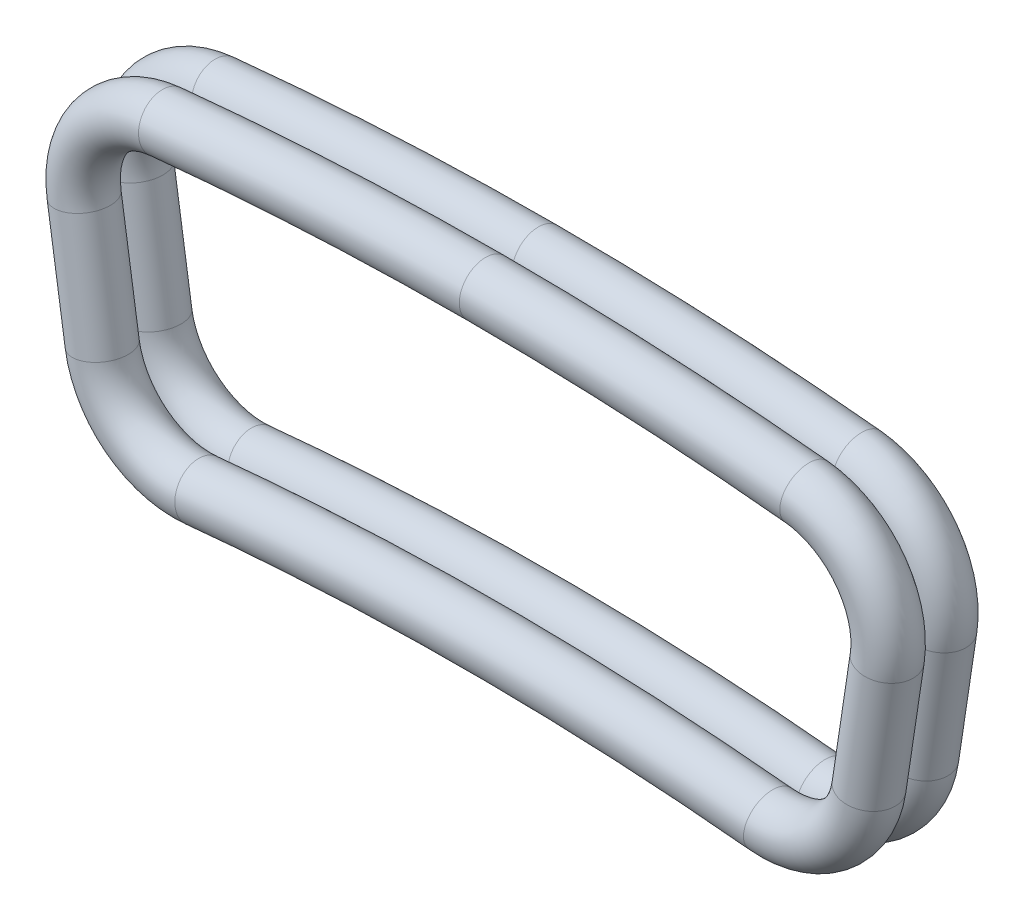
ISO-10303-21;
HEADER;
FILE_DESCRIPTION(('STEP AP214'),'2;1');
FILE_NAME('part.step','',(''),(''),'','','');
FILE_SCHEMA(('AUTOMOTIVE_DESIGN { 1 0 10303 214 1 1 1 1 }'));
ENDSEC;
DATA;
#1=APPLICATION_CONTEXT('core data for automotive mechanical design processes');
#2=APPLICATION_PROTOCOL_DEFINITION('international standard','automotive_design',2000,#1);
#3=PRODUCT_CONTEXT('',#1,'mechanical');
#4=PRODUCT('Part','Part','',(#3));
#5=PRODUCT_RELATED_PRODUCT_CATEGORY('part','',(#4));
#6=PRODUCT_DEFINITION_FORMATION('','',#4);
#7=PRODUCT_DEFINITION_CONTEXT('part definition',#1,'design');
#8=PRODUCT_DEFINITION('design','',#6,#7);
#9=PRODUCT_DEFINITION_SHAPE('','',#8);
#10=(LENGTH_UNIT() NAMED_UNIT(*) SI_UNIT(.MILLI.,.METRE.));
#11=(NAMED_UNIT(*) PLANE_ANGLE_UNIT() SI_UNIT($,.RADIAN.));
#12=(NAMED_UNIT(*) SI_UNIT($,.STERADIAN.) SOLID_ANGLE_UNIT());
#13=UNCERTAINTY_MEASURE_WITH_UNIT(LENGTH_MEASURE(1.E-05),#10,'distance_accuracy_value','');
#14=(GEOMETRIC_REPRESENTATION_CONTEXT(3) GLOBAL_UNCERTAINTY_ASSIGNED_CONTEXT((#13)) GLOBAL_UNIT_ASSIGNED_CONTEXT((#10,
#11,#12)) REPRESENTATION_CONTEXT('',''));
#15=CARTESIAN_POINT('',(0.,0.,0.));
#16=DIRECTION('',(0.,0.,1.));
#17=DIRECTION('',(1.,0.,0.));
#18=AXIS2_PLACEMENT_3D('',#15,#16,#17);
#19=CARTESIAN_POINT('',(0.,0.,-0.757999999999999));
#20=DIRECTION('',(0.,0.,-1.));
#21=DIRECTION('',(-1.,0.,0.));
#22=AXIS2_PLACEMENT_3D('',#19,#20,#21);
#23=TOROIDAL_SURFACE('',#22,98.186,0.814000000000007);
#24=CARTESIAN_POINT('',(-9.90528882125347,97.6850850916738,-0.757999999999999));
#25=DIRECTION('',(0.994898306191044,0.100882904092778,0.));
#26=DIRECTION('',(0.,0.,-1.));
#27=AXIS2_PLACEMENT_3D('',#24,#25,#26);
#28=CIRCLE('',#27,0.814000000000007);
#29=CARTESIAN_POINT('',(-9.98740750518499,98.4949323129133,-0.757999999999999));
#30=VERTEX_POINT('',#29);
#31=EDGE_CURVE('E11',#30,#30,#28,.T.);
#32=CARTESIAN_POINT('',(0.,98.186,-0.757999999999999));
#33=DIRECTION('',(1.,0.,0.));
#34=DIRECTION('',(0.,0.,-1.));
#35=AXIS2_PLACEMENT_3D('',#32,#33,#34);
#36=CIRCLE('',#35,0.814000000000007);
#37=CARTESIAN_POINT('',(0.,99.,-0.757999999999999));
#38=VERTEX_POINT('',#37);
#39=EDGE_CURVE('E78',#38,#38,#36,.T.);
#40=CARTESIAN_POINT('',(0.,0.,-0.757999999999999));
#41=DIRECTION('',(0.,0.,-1.));
#42=DIRECTION('',(-1.,0.,0.));
#43=AXIS2_PLACEMENT_3D('',#40,#41,#42);
#44=CIRCLE('',#43,99.);
#45=EDGE_CURVE('',#30,#38,#44,.T.);
#46=ORIENTED_EDGE('',*,*,#31,.T.);
#47=ORIENTED_EDGE('',*,*,#39,.F.);
#48=ORIENTED_EDGE('',*,*,#45,.T.);
#49=ORIENTED_EDGE('',*,*,#45,.F.);
#50=EDGE_LOOP('',(#46,#48,#47,#49));
#51=FACE_BOUND('',#50,.T.);
#52=ADVANCED_FACE('F47',(#51),#23,.T.);
#53=CARTESIAN_POINT('',(-9.62140432913657,94.8854412580522,-0.757999999999999));
#54=DIRECTION('',(0.,0.,-1.));
#55=DIRECTION('',(-1.,0.,0.));
#56=AXIS2_PLACEMENT_3D('',#53,#54,#55);
#57=TOROIDAL_SURFACE('',#56,2.81400000000001,0.814000000000007);
#58=CARTESIAN_POINT('',(-12.4039742741341,94.4660363210325,-0.757999999999999));
#59=DIRECTION('',(-0.149042266176174,0.988830826225129,0.));
#60=DIRECTION('',(0.,0.,-1.));
#61=AXIS2_PLACEMENT_3D('',#58,#59,#60);
#62=CIRCLE('',#61,0.814000000000007);
#63=CARTESIAN_POINT('',(-13.2088825666814,94.3447159163651,-0.757999999999999));
#64=VERTEX_POINT('',#63);
#65=EDGE_CURVE('E53',#64,#64,#62,.T.);
#66=CARTESIAN_POINT('',(-9.62140432913657,94.8854412580522,-0.757999999999999));
#67=DIRECTION('',(0.,0.,-1.));
#68=DIRECTION('',(-1.,0.,0.));
#69=AXIS2_PLACEMENT_3D('',#66,#67,#68);
#70=CIRCLE('',#69,3.62800000000002);
#71=EDGE_CURVE('',#64,#30,#70,.T.);
#72=ORIENTED_EDGE('',*,*,#65,.T.);
#73=ORIENTED_EDGE('',*,*,#31,.F.);
#74=ORIENTED_EDGE('',*,*,#71,.T.);
#75=ORIENTED_EDGE('',*,*,#71,.F.);
#76=EDGE_LOOP('',(#72,#74,#73,#75));
#77=FACE_BOUND('',#76,.T.);
#78=ADVANCED_FACE('F85',(#77),#57,.T.);
#79=CARTESIAN_POINT('',(-11.8452749318046,90.7593083809587,-0.757999999999999));
#80=DIRECTION('',(-0.149042266176174,0.988830826225129,0.));
#81=DIRECTION('',(-0.988830826225129,-0.149042266176174,0.));
#82=AXIS2_PLACEMENT_3D('',#79,#80,#81);
#83=CYLINDRICAL_SURFACE('',#82,0.814000000000007);
#84=ORIENTED_EDGE('',*,*,#65,.F.);
#85=EDGE_LOOP('',(#84));
#86=FACE_BOUND('',#85,.T.);
#87=CARTESIAN_POINT('',(-11.8452749318046,90.7593083809587,-0.757999999999999));
#88=DIRECTION('',(-0.149042266176173,0.988830826225129,0.));
#89=DIRECTION('',(0.,0.,-1.));
#90=AXIS2_PLACEMENT_3D('',#87,#88,#89);
#91=CIRCLE('',#90,0.814000000000007);
#92=CARTESIAN_POINT('',(-12.6501832243518,90.6379879762913,-0.757999999999999));
#93=VERTEX_POINT('',#92);
#94=EDGE_CURVE('E57',#93,#93,#91,.T.);
#95=ORIENTED_EDGE('',*,*,#94,.T.);
#96=EDGE_LOOP('',(#95));
#97=FACE_BOUND('',#96,.T.);
#98=ADVANCED_FACE('F89',(#86,#97),#83,.T.);
#99=CARTESIAN_POINT('',(-9.06270498680705,91.1787133179785,-0.757999999999999));
#100=DIRECTION('',(0.,0.,-1.));
#101=DIRECTION('',(-1.,0.,0.));
#102=AXIS2_PLACEMENT_3D('',#99,#100,#101);
#103=TOROIDAL_SURFACE('',#102,2.81399999999999,0.814000000000007);
#104=CARTESIAN_POINT('',(-8.78437901840359,88.378511422523,-0.757999999999999));
#105=DIRECTION('',(-0.995096622407763,-0.098907593604652,0.));
#106=DIRECTION('',(0.,0.,-1.));
#107=AXIS2_PLACEMENT_3D('',#104,#105,#106);
#108=CIRCLE('',#107,0.814000000000007);
#109=CARTESIAN_POINT('',(-8.70386823720942,87.5685027718831,-0.757999999999999));
#110=VERTEX_POINT('',#109);
#111=EDGE_CURVE('E61',#110,#110,#108,.T.);
#112=CARTESIAN_POINT('',(-9.06270498680705,91.1787133179785,-0.757999999999999));
#113=DIRECTION('',(0.,0.,-1.));
#114=DIRECTION('',(-1.,0.,0.));
#115=AXIS2_PLACEMENT_3D('',#112,#113,#114);
#116=CIRCLE('',#115,3.62799999999999);
#117=EDGE_CURVE('',#110,#93,#116,.T.);
#118=ORIENTED_EDGE('',*,*,#111,.T.);
#119=ORIENTED_EDGE('',*,*,#94,.F.);
#120=ORIENTED_EDGE('',*,*,#117,.T.);
#121=ORIENTED_EDGE('',*,*,#117,.F.);
#122=EDGE_LOOP('',(#118,#120,#119,#121));
#123=FACE_BOUND('',#122,.T.);
#124=ADVANCED_FACE('F94',(#123),#103,.T.);
#125=CARTESIAN_POINT('',(0.,0.,-0.757999999999999));
#126=DIRECTION('',(0.,0.,1.));
#127=DIRECTION('',(1.,0.,0.));
#128=AXIS2_PLACEMENT_3D('',#125,#126,#127);
#129=TOROIDAL_SURFACE('',#128,88.814,0.814000000000007);
#130=ORIENTED_EDGE('',*,*,#111,.F.);
#131=EDGE_LOOP('',(#130));
#132=FACE_BOUND('',#131,.T.);
#133=CARTESIAN_POINT('',(8.78437901840353,88.378511422523,-0.757999999999999));
#134=DIRECTION('',(-0.995096622407762,0.0989075936046599,0.));
#135=DIRECTION('',(0.,0.,-1.));
#136=AXIS2_PLACEMENT_3D('',#133,#134,#135);
#137=CIRCLE('',#136,0.814000000000007);
#138=CARTESIAN_POINT('',(8.70386823720933,87.5685027718831,-0.757999999999999));
#139=VERTEX_POINT('',#138);
#140=EDGE_CURVE('E66',#139,#139,#137,.T.);
#141=ORIENTED_EDGE('',*,*,#140,.T.);
#142=EDGE_LOOP('',(#141));
#143=FACE_BOUND('',#142,.T.);
#144=ADVANCED_FACE('F100',(#132,#143),#129,.T.);
#145=CARTESIAN_POINT('',(9.06270498680706,91.1787133179785,-0.757999999999999));
#146=DIRECTION('',(0.,0.,-1.));
#147=DIRECTION('',(-1.,0.,0.));
#148=AXIS2_PLACEMENT_3D('',#145,#146,#147);
#149=TOROIDAL_SURFACE('',#148,2.814,0.814000000000007);
#150=CARTESIAN_POINT('',(11.8452749318046,90.7593083809587,-0.757999999999999));
#151=DIRECTION('',(-0.149042266176172,-0.988830826225129,0.));
#152=DIRECTION('',(0.,0.,-1.));
#153=AXIS2_PLACEMENT_3D('',#150,#151,#152);
#154=CIRCLE('',#153,0.814000000000007);
#155=CARTESIAN_POINT('',(12.6501832243518,90.6379879762913,-0.757999999999999));
#156=VERTEX_POINT('',#155);
#157=EDGE_CURVE('E69',#156,#156,#154,.T.);
#158=CARTESIAN_POINT('',(9.06270498680706,91.1787133179785,-0.757999999999999));
#159=DIRECTION('',(0.,0.,-1.));
#160=DIRECTION('',(-1.,0.,0.));
#161=AXIS2_PLACEMENT_3D('',#158,#159,#160);
#162=CIRCLE('',#161,3.62800000000001);
#163=EDGE_CURVE('',#156,#139,#162,.T.);
#164=ORIENTED_EDGE('',*,*,#157,.T.);
#165=ORIENTED_EDGE('',*,*,#140,.F.);
#166=ORIENTED_EDGE('',*,*,#163,.T.);
#167=ORIENTED_EDGE('',*,*,#163,.F.);
#168=EDGE_LOOP('',(#164,#166,#165,#167));
#169=FACE_BOUND('',#168,.T.);
#170=ADVANCED_FACE('F104',(#169),#149,.T.);
#171=CARTESIAN_POINT('',(12.4039742741341,94.4660363210324,-0.757999999999999));
#172=DIRECTION('',(-0.149042266176172,-0.988830826225129,0.));
#173=DIRECTION('',(0.988830826225129,-0.149042266176172,0.));
#174=AXIS2_PLACEMENT_3D('',#171,#172,#173);
#175=CYLINDRICAL_SURFACE('',#174,0.814000000000007);
#176=ORIENTED_EDGE('',*,*,#157,.F.);
#177=EDGE_LOOP('',(#176));
#178=FACE_BOUND('',#177,.T.);
#179=CARTESIAN_POINT('',(12.4039742741341,94.4660363210324,-0.757999999999999));
#180=DIRECTION('',(-0.149042266176173,-0.988830826225129,0.));
#181=DIRECTION('',(0.,0.,-1.));
#182=AXIS2_PLACEMENT_3D('',#179,#180,#181);
#183=CIRCLE('',#182,0.814000000000007);
#184=CARTESIAN_POINT('',(13.2088825666813,94.344715916365,-0.757999999999999));
#185=VERTEX_POINT('',#184);
#186=EDGE_CURVE('E72',#185,#185,#183,.T.);
#187=ORIENTED_EDGE('',*,*,#186,.T.);
#188=EDGE_LOOP('',(#187));
#189=FACE_BOUND('',#188,.T.);
#190=ADVANCED_FACE('F108',(#178,#189),#175,.T.);
#191=CARTESIAN_POINT('',(9.62140432913657,94.8854412580522,-0.757999999999999));
#192=DIRECTION('',(0.,0.,-1.));
#193=DIRECTION('',(-1.,0.,0.));
#194=AXIS2_PLACEMENT_3D('',#191,#192,#193);
#195=TOROIDAL_SURFACE('',#194,2.814,0.814000000000007);
#196=CARTESIAN_POINT('',(9.90528882125363,97.6850850916738,-0.757999999999999));
#197=DIRECTION('',(0.994898306191043,-0.100882904092779,0.));
#198=DIRECTION('',(0.,0.,-1.));
#199=AXIS2_PLACEMENT_3D('',#196,#197,#198);
#200=CIRCLE('',#199,0.814000000000007);
#201=CARTESIAN_POINT('',(9.98740750518514,98.4949323129133,-0.757999999999999));
#202=VERTEX_POINT('',#201);
#203=EDGE_CURVE('E75',#202,#202,#200,.T.);
#204=CARTESIAN_POINT('',(9.62140432913657,94.8854412580522,-0.757999999999999));
#205=DIRECTION('',(0.,0.,-1.));
#206=DIRECTION('',(-1.,0.,0.));
#207=AXIS2_PLACEMENT_3D('',#204,#205,#206);
#208=CIRCLE('',#207,3.62800000000001);
#209=EDGE_CURVE('',#202,#185,#208,.T.);
#210=ORIENTED_EDGE('',*,*,#203,.T.);
#211=ORIENTED_EDGE('',*,*,#186,.F.);
#212=ORIENTED_EDGE('',*,*,#209,.T.);
#213=ORIENTED_EDGE('',*,*,#209,.F.);
#214=EDGE_LOOP('',(#210,#212,#211,#213));
#215=FACE_BOUND('',#214,.T.);
#216=ADVANCED_FACE('F112',(#215),#195,.T.);
#217=CARTESIAN_POINT('',(0.,0.,-0.757999999999999));
#218=DIRECTION('',(0.,0.,-1.));
#219=DIRECTION('',(-1.,0.,0.));
#220=AXIS2_PLACEMENT_3D('',#217,#218,#219);
#221=TOROIDAL_SURFACE('',#220,98.186,0.814000000000007);
#222=CARTESIAN_POINT('',(0.,0.,-0.757999999999999));
#223=DIRECTION('',(0.,0.,-1.));
#224=DIRECTION('',(-1.,0.,0.));
#225=AXIS2_PLACEMENT_3D('',#222,#223,#224);
#226=CIRCLE('',#225,99.);
#227=EDGE_CURVE('',#38,#202,#226,.T.);
#228=ORIENTED_EDGE('',*,*,#39,.T.);
#229=ORIENTED_EDGE('',*,*,#203,.F.);
#230=ORIENTED_EDGE('',*,*,#227,.T.);
#231=ORIENTED_EDGE('',*,*,#227,.F.);
#232=EDGE_LOOP('',(#228,#230,#229,#231));
#233=FACE_BOUND('',#232,.T.);
#234=ADVANCED_FACE('F82',(#233),#221,.T.);
#235=CLOSED_SHELL('',(#52,#78,#98,#124,#144,#170,#190,#216,#234));
#236=MANIFOLD_SOLID_BREP('B2',#235);
#237=CARTESIAN_POINT('',(0.,0.,-2.386));
#238=DIRECTION('',(0.,0.,-1.));
#239=DIRECTION('',(-1.,0.,0.));
#240=AXIS2_PLACEMENT_3D('',#237,#238,#239);
#241=TOROIDAL_SURFACE('',#240,98.186,0.814000000000007);
#242=CARTESIAN_POINT('',(-9.90528882125347,97.6850850916738,-2.386));
#243=DIRECTION('',(0.994898306191044,0.100882904092778,0.));
#244=DIRECTION('',(0.,0.,-1.));
#245=AXIS2_PLACEMENT_3D('',#242,#243,#244);
#246=CIRCLE('',#245,0.814000000000007);
#247=CARTESIAN_POINT('',(-9.98740750518499,98.4949323129133,-2.386));
#248=VERTEX_POINT('',#247);
#249=EDGE_CURVE('E46',#248,#248,#246,.T.);
#250=CARTESIAN_POINT('',(0.,98.186,-2.386));
#251=DIRECTION('',(1.,0.,0.));
#252=DIRECTION('',(0.,0.,-1.));
#253=AXIS2_PLACEMENT_3D('',#250,#251,#252);
#254=CIRCLE('',#253,0.814000000000007);
#255=CARTESIAN_POINT('',(0.,99.,-2.386));
#256=VERTEX_POINT('',#255);
#257=EDGE_CURVE('E215',#256,#256,#254,.T.);
#258=CARTESIAN_POINT('',(0.,0.,-2.386));
#259=DIRECTION('',(0.,0.,-1.));
#260=DIRECTION('',(-1.,0.,0.));
#261=AXIS2_PLACEMENT_3D('',#258,#259,#260);
#262=CIRCLE('',#261,99.);
#263=EDGE_CURVE('',#248,#256,#262,.T.);
#264=ORIENTED_EDGE('',*,*,#249,.T.);
#265=ORIENTED_EDGE('',*,*,#257,.F.);
#266=ORIENTED_EDGE('',*,*,#263,.T.);
#267=ORIENTED_EDGE('',*,*,#263,.F.);
#268=EDGE_LOOP('',(#264,#266,#265,#267));
#269=FACE_BOUND('',#268,.T.);
#270=ADVANCED_FACE('F184',(#269),#241,.T.);
#271=CARTESIAN_POINT('',(-9.62140432913657,94.8854412580522,-2.386));
#272=DIRECTION('',(0.,0.,-1.));
#273=DIRECTION('',(-1.,0.,0.));
#274=AXIS2_PLACEMENT_3D('',#271,#272,#273);
#275=TOROIDAL_SURFACE('',#274,2.81400000000001,0.814000000000007);
#276=CARTESIAN_POINT('',(-12.4039742741341,94.4660363210325,-2.386));
#277=DIRECTION('',(-0.149042266176174,0.988830826225129,0.));
#278=DIRECTION('',(0.,0.,-1.));
#279=AXIS2_PLACEMENT_3D('',#276,#277,#278);
#280=CIRCLE('',#279,0.814000000000007);
#281=CARTESIAN_POINT('',(-13.2088825666814,94.3447159163651,-2.386));
#282=VERTEX_POINT('',#281);
#283=EDGE_CURVE('E190',#282,#282,#280,.T.);
#284=CARTESIAN_POINT('',(-9.62140432913657,94.8854412580522,-2.386));
#285=DIRECTION('',(0.,0.,-1.));
#286=DIRECTION('',(-1.,0.,0.));
#287=AXIS2_PLACEMENT_3D('',#284,#285,#286);
#288=CIRCLE('',#287,3.62800000000002);
#289=EDGE_CURVE('',#282,#248,#288,.T.);
#290=ORIENTED_EDGE('',*,*,#283,.T.);
#291=ORIENTED_EDGE('',*,*,#249,.F.);
#292=ORIENTED_EDGE('',*,*,#289,.T.);
#293=ORIENTED_EDGE('',*,*,#289,.F.);
#294=EDGE_LOOP('',(#290,#292,#291,#293));
#295=FACE_BOUND('',#294,.T.);
#296=ADVANCED_FACE('F222',(#295),#275,.T.);
#297=CARTESIAN_POINT('',(-11.8452749318046,90.7593083809587,-2.386));
#298=DIRECTION('',(-0.149042266176174,0.988830826225129,0.));
#299=DIRECTION('',(-0.988830826225129,-0.149042266176174,0.));
#300=AXIS2_PLACEMENT_3D('',#297,#298,#299);
#301=CYLINDRICAL_SURFACE('',#300,0.814000000000007);
#302=ORIENTED_EDGE('',*,*,#283,.F.);
#303=EDGE_LOOP('',(#302));
#304=FACE_BOUND('',#303,.T.);
#305=CARTESIAN_POINT('',(-11.8452749318046,90.7593083809587,-2.386));
#306=DIRECTION('',(-0.149042266176173,0.988830826225129,0.));
#307=DIRECTION('',(0.,0.,-1.));
#308=AXIS2_PLACEMENT_3D('',#305,#306,#307);
#309=CIRCLE('',#308,0.814000000000007);
#310=CARTESIAN_POINT('',(-12.6501832243518,90.6379879762913,-2.386));
#311=VERTEX_POINT('',#310);
#312=EDGE_CURVE('E194',#311,#311,#309,.T.);
#313=ORIENTED_EDGE('',*,*,#312,.T.);
#314=EDGE_LOOP('',(#313));
#315=FACE_BOUND('',#314,.T.);
#316=ADVANCED_FACE('F226',(#304,#315),#301,.T.);
#317=CARTESIAN_POINT('',(-9.06270498680705,91.1787133179785,-2.386));
#318=DIRECTION('',(0.,0.,-1.));
#319=DIRECTION('',(-1.,0.,0.));
#320=AXIS2_PLACEMENT_3D('',#317,#318,#319);
#321=TOROIDAL_SURFACE('',#320,2.81399999999999,0.814000000000007);
#322=CARTESIAN_POINT('',(-8.78437901840359,88.378511422523,-2.386));
#323=DIRECTION('',(-0.995096622407763,-0.098907593604652,0.));
#324=DIRECTION('',(0.,0.,-1.));
#325=AXIS2_PLACEMENT_3D('',#322,#323,#324);
#326=CIRCLE('',#325,0.814000000000007);
#327=CARTESIAN_POINT('',(-8.70386823720942,87.5685027718831,-2.386));
#328=VERTEX_POINT('',#327);
#329=EDGE_CURVE('E198',#328,#328,#326,.T.);
#330=CARTESIAN_POINT('',(-9.06270498680705,91.1787133179785,-2.386));
#331=DIRECTION('',(0.,0.,-1.));
#332=DIRECTION('',(-1.,0.,0.));
#333=AXIS2_PLACEMENT_3D('',#330,#331,#332);
#334=CIRCLE('',#333,3.62799999999999);
#335=EDGE_CURVE('',#328,#311,#334,.T.);
#336=ORIENTED_EDGE('',*,*,#329,.T.);
#337=ORIENTED_EDGE('',*,*,#312,.F.);
#338=ORIENTED_EDGE('',*,*,#335,.T.);
#339=ORIENTED_EDGE('',*,*,#335,.F.);
#340=EDGE_LOOP('',(#336,#338,#337,#339));
#341=FACE_BOUND('',#340,.T.);
#342=ADVANCED_FACE('F231',(#341),#321,.T.);
#343=CARTESIAN_POINT('',(0.,0.,-2.386));
#344=DIRECTION('',(0.,0.,1.));
#345=DIRECTION('',(1.,0.,0.));
#346=AXIS2_PLACEMENT_3D('',#343,#344,#345);
#347=TOROIDAL_SURFACE('',#346,88.814,0.814000000000007);
#348=ORIENTED_EDGE('',*,*,#329,.F.);
#349=EDGE_LOOP('',(#348));
#350=FACE_BOUND('',#349,.T.);
#351=CARTESIAN_POINT('',(8.78437901840353,88.378511422523,-2.386));
#352=DIRECTION('',(-0.995096622407762,0.0989075936046599,0.));
#353=DIRECTION('',(0.,0.,-1.));
#354=AXIS2_PLACEMENT_3D('',#351,#352,#353);
#355=CIRCLE('',#354,0.814000000000007);
#356=CARTESIAN_POINT('',(8.70386823720933,87.5685027718831,-2.386));
#357=VERTEX_POINT('',#356);
#358=EDGE_CURVE('E203',#357,#357,#355,.T.);
#359=ORIENTED_EDGE('',*,*,#358,.T.);
#360=EDGE_LOOP('',(#359));
#361=FACE_BOUND('',#360,.T.);
#362=ADVANCED_FACE('F237',(#350,#361),#347,.T.);
#363=CARTESIAN_POINT('',(9.06270498680706,91.1787133179785,-2.386));
#364=DIRECTION('',(0.,0.,-1.));
#365=DIRECTION('',(-1.,0.,0.));
#366=AXIS2_PLACEMENT_3D('',#363,#364,#365);
#367=TOROIDAL_SURFACE('',#366,2.814,0.814000000000007);
#368=CARTESIAN_POINT('',(11.8452749318046,90.7593083809587,-2.386));
#369=DIRECTION('',(-0.149042266176172,-0.988830826225129,0.));
#370=DIRECTION('',(0.,0.,-1.));
#371=AXIS2_PLACEMENT_3D('',#368,#369,#370);
#372=CIRCLE('',#371,0.814000000000007);
#373=CARTESIAN_POINT('',(12.6501832243518,90.6379879762913,-2.386));
#374=VERTEX_POINT('',#373);
#375=EDGE_CURVE('E206',#374,#374,#372,.T.);
#376=CARTESIAN_POINT('',(9.06270498680706,91.1787133179785,-2.386));
#377=DIRECTION('',(0.,0.,-1.));
#378=DIRECTION('',(-1.,0.,0.));
#379=AXIS2_PLACEMENT_3D('',#376,#377,#378);
#380=CIRCLE('',#379,3.62800000000001);
#381=EDGE_CURVE('',#374,#357,#380,.T.);
#382=ORIENTED_EDGE('',*,*,#375,.T.);
#383=ORIENTED_EDGE('',*,*,#358,.F.);
#384=ORIENTED_EDGE('',*,*,#381,.T.);
#385=ORIENTED_EDGE('',*,*,#381,.F.);
#386=EDGE_LOOP('',(#382,#384,#383,#385));
#387=FACE_BOUND('',#386,.T.);
#388=ADVANCED_FACE('F241',(#387),#367,.T.);
#389=CARTESIAN_POINT('',(12.4039742741341,94.4660363210324,-2.386));
#390=DIRECTION('',(-0.149042266176172,-0.988830826225129,0.));
#391=DIRECTION('',(0.988830826225129,-0.149042266176172,0.));
#392=AXIS2_PLACEMENT_3D('',#389,#390,#391);
#393=CYLINDRICAL_SURFACE('',#392,0.814000000000007);
#394=ORIENTED_EDGE('',*,*,#375,.F.);
#395=EDGE_LOOP('',(#394));
#396=FACE_BOUND('',#395,.T.);
#397=CARTESIAN_POINT('',(12.4039742741341,94.4660363210324,-2.386));
#398=DIRECTION('',(-0.149042266176173,-0.988830826225129,0.));
#399=DIRECTION('',(0.,0.,-1.));
#400=AXIS2_PLACEMENT_3D('',#397,#398,#399);
#401=CIRCLE('',#400,0.814000000000007);
#402=CARTESIAN_POINT('',(13.2088825666813,94.344715916365,-2.386));
#403=VERTEX_POINT('',#402);
#404=EDGE_CURVE('E209',#403,#403,#401,.T.);
#405=ORIENTED_EDGE('',*,*,#404,.T.);
#406=EDGE_LOOP('',(#405));
#407=FACE_BOUND('',#406,.T.);
#408=ADVANCED_FACE('F245',(#396,#407),#393,.T.);
#409=CARTESIAN_POINT('',(9.62140432913657,94.8854412580522,-2.386));
#410=DIRECTION('',(0.,0.,-1.));
#411=DIRECTION('',(-1.,0.,0.));
#412=AXIS2_PLACEMENT_3D('',#409,#410,#411);
#413=TOROIDAL_SURFACE('',#412,2.814,0.814000000000007);
#414=CARTESIAN_POINT('',(9.90528882125363,97.6850850916738,-2.386));
#415=DIRECTION('',(0.994898306191043,-0.100882904092779,0.));
#416=DIRECTION('',(0.,0.,-1.));
#417=AXIS2_PLACEMENT_3D('',#414,#415,#416);
#418=CIRCLE('',#417,0.814000000000007);
#419=CARTESIAN_POINT('',(9.98740750518514,98.4949323129133,-2.386));
#420=VERTEX_POINT('',#419);
#421=EDGE_CURVE('E212',#420,#420,#418,.T.);
#422=CARTESIAN_POINT('',(9.62140432913657,94.8854412580522,-2.386));
#423=DIRECTION('',(0.,0.,-1.));
#424=DIRECTION('',(-1.,0.,0.));
#425=AXIS2_PLACEMENT_3D('',#422,#423,#424);
#426=CIRCLE('',#425,3.62800000000001);
#427=EDGE_CURVE('',#420,#403,#426,.T.);
#428=ORIENTED_EDGE('',*,*,#421,.T.);
#429=ORIENTED_EDGE('',*,*,#404,.F.);
#430=ORIENTED_EDGE('',*,*,#427,.T.);
#431=ORIENTED_EDGE('',*,*,#427,.F.);
#432=EDGE_LOOP('',(#428,#430,#429,#431));
#433=FACE_BOUND('',#432,.T.);
#434=ADVANCED_FACE('F249',(#433),#413,.T.);
#435=CARTESIAN_POINT('',(0.,0.,-2.386));
#436=DIRECTION('',(0.,0.,-1.));
#437=DIRECTION('',(-1.,0.,0.));
#438=AXIS2_PLACEMENT_3D('',#435,#436,#437);
#439=TOROIDAL_SURFACE('',#438,98.186,0.814000000000007);
#440=CARTESIAN_POINT('',(0.,0.,-2.386));
#441=DIRECTION('',(0.,0.,-1.));
#442=DIRECTION('',(-1.,0.,0.));
#443=AXIS2_PLACEMENT_3D('',#440,#441,#442);
#444=CIRCLE('',#443,99.);
#445=EDGE_CURVE('',#256,#420,#444,.T.);
#446=ORIENTED_EDGE('',*,*,#257,.T.);
#447=ORIENTED_EDGE('',*,*,#421,.F.);
#448=ORIENTED_EDGE('',*,*,#445,.T.);
#449=ORIENTED_EDGE('',*,*,#445,.F.);
#450=EDGE_LOOP('',(#446,#448,#447,#449));
#451=FACE_BOUND('',#450,.T.);
#452=ADVANCED_FACE('F219',(#451),#439,.T.);
#453=CLOSED_SHELL('',(#270,#296,#316,#342,#362,#388,#408,#434,#452));
#454=MANIFOLD_SOLID_BREP('B6',#453);
#455=ADVANCED_BREP_SHAPE_REPRESENTATION('',(#18,#236,#454),#14);
#456=SHAPE_DEFINITION_REPRESENTATION(#9,#455);
ENDSEC;
END-ISO-10303-21;
